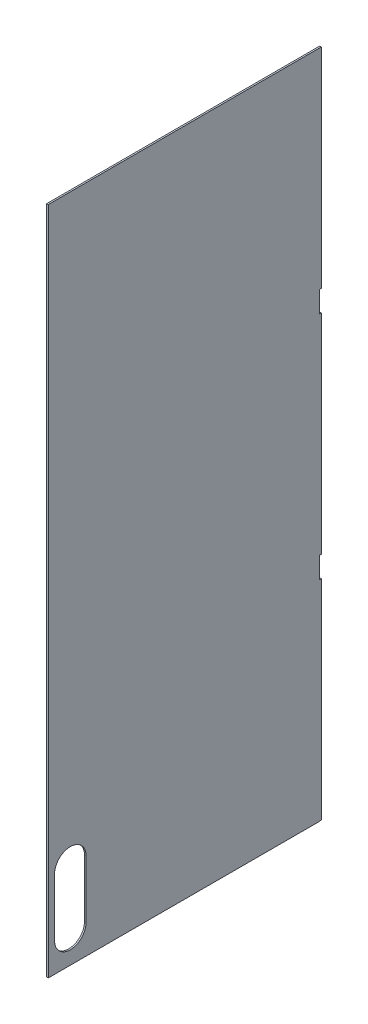
ISO-10303-21;
HEADER;
FILE_DESCRIPTION(('STEP AP214'),'2;1');
FILE_NAME('part.step','',(''),(''),'','','');
FILE_SCHEMA(('AUTOMOTIVE_DESIGN { 1 0 10303 214 1 1 1 1 }'));
ENDSEC;
DATA;
#1=APPLICATION_CONTEXT('core data for automotive mechanical design processes');
#2=APPLICATION_PROTOCOL_DEFINITION('international standard','automotive_design',2000,#1);
#3=PRODUCT_CONTEXT('',#1,'mechanical');
#4=PRODUCT('Part','Part','',(#3));
#5=PRODUCT_RELATED_PRODUCT_CATEGORY('part','',(#4));
#6=PRODUCT_DEFINITION_FORMATION('','',#4);
#7=PRODUCT_DEFINITION_CONTEXT('part definition',#1,'design');
#8=PRODUCT_DEFINITION('design','',#6,#7);
#9=PRODUCT_DEFINITION_SHAPE('','',#8);
#10=(LENGTH_UNIT() NAMED_UNIT(*) SI_UNIT(.MILLI.,.METRE.));
#11=(NAMED_UNIT(*) PLANE_ANGLE_UNIT() SI_UNIT($,.RADIAN.));
#12=(NAMED_UNIT(*) SI_UNIT($,.STERADIAN.) SOLID_ANGLE_UNIT());
#13=UNCERTAINTY_MEASURE_WITH_UNIT(LENGTH_MEASURE(1.E-05),#10,'distance_accuracy_value','');
#14=(GEOMETRIC_REPRESENTATION_CONTEXT(3) GLOBAL_UNCERTAINTY_ASSIGNED_CONTEXT((#13)) GLOBAL_UNIT_ASSIGNED_CONTEXT((#10,
#11,#12)) REPRESENTATION_CONTEXT('',''));
#15=CARTESIAN_POINT('',(0.,0.,0.));
#16=DIRECTION('',(0.,0.,1.));
#17=DIRECTION('',(1.,0.,0.));
#18=AXIS2_PLACEMENT_3D('',#15,#16,#17);
#19=CARTESIAN_POINT('',(-726.5,-317.792893218814,1.));
#20=DIRECTION('',(1.,0.,0.));
#21=DIRECTION('',(0.,0.,-1.));
#22=AXIS2_PLACEMENT_3D('',#19,#20,#21);
#23=PLANE('',#22);
#24=CARTESIAN_POINT('',(-726.500000000001,-235.,237.5));
#25=DIRECTION('',(-1.,0.,0.));
#26=DIRECTION('',(0.,0.,1.));
#27=AXIS2_PLACEMENT_3D('',#24,#25,#26);
#28=CIRCLE('',#27,14.9999999999999);
#29=CARTESIAN_POINT('',(-726.500000000001,-235.,252.5));
#30=VERTEX_POINT('',#29);
#31=CARTESIAN_POINT('',(-726.500000000001,-235.,222.5));
#32=VERTEX_POINT('',#31);
#33=EDGE_CURVE('E298',#30,#32,#28,.T.);
#34=ORIENTED_EDGE('',*,*,#33,.T.);
#35=DIRECTION('',(0.,1.,0.));
#36=VECTOR('',#35,1.);
#37=CARTESIAN_POINT('',(-726.500000000001,0.,222.5));
#38=LINE('',#37,#36);
#39=CARTESIAN_POINT('',(-726.500000000001,-290.,222.5));
#40=VERTEX_POINT('',#39);
#41=EDGE_CURVE('E317',#32,#40,#38,.F.);
#42=ORIENTED_EDGE('',*,*,#41,.T.);
#43=CARTESIAN_POINT('',(-726.500000000001,-290.,237.5));
#44=DIRECTION('',(-1.,0.,0.));
#45=DIRECTION('',(0.,0.,1.));
#46=AXIS2_PLACEMENT_3D('',#43,#44,#45);
#47=CIRCLE('',#46,14.9999999999999);
#48=CARTESIAN_POINT('',(-726.500000000001,-290.,252.5));
#49=VERTEX_POINT('',#48);
#50=EDGE_CURVE('E339',#40,#49,#47,.T.);
#51=ORIENTED_EDGE('',*,*,#50,.T.);
#52=DIRECTION('',(0.,1.,0.));
#53=VECTOR('',#52,1.);
#54=CARTESIAN_POINT('',(-726.500000000001,0.,252.5));
#55=LINE('',#54,#53);
#56=EDGE_CURVE('E333',#49,#30,#55,.T.);
#57=ORIENTED_EDGE('',*,*,#56,.T.);
#58=EDGE_LOOP('',(#34,#42,#51,#57));
#59=FACE_BOUND('',#58,.T.);
#60=DIRECTION('',(0.,1.,0.));
#61=VECTOR('',#60,1.);
#62=CARTESIAN_POINT('',(-726.5,120.884517796865,0.1));
#63=LINE('',#62,#61);
#64=CARTESIAN_POINT('',(-726.5,100.684517796864,0.1));
#65=VERTEX_POINT('',#64);
#66=CARTESIAN_POINT('',(-726.5,120.884517796865,0.1));
#67=VERTEX_POINT('',#66);
#68=EDGE_CURVE('E299',#65,#67,#63,.T.);
#69=ORIENTED_EDGE('',*,*,#68,.T.);
#70=DIRECTION('',(0.,0.,-1.));
#71=VECTOR('',#70,1.);
#72=CARTESIAN_POINT('',(-726.5,120.884517796865,0.1));
#73=LINE('',#72,#71);
#74=CARTESIAN_POINT('',(-726.5,120.884517796865,-1.5));
#75=VERTEX_POINT('',#74);
#76=EDGE_CURVE('E204',#67,#75,#73,.T.);
#77=ORIENTED_EDGE('',*,*,#76,.T.);
#78=DIRECTION('',(0.,-1.,0.));
#79=VECTOR('',#78,1.);
#80=CARTESIAN_POINT('',(-726.5,0.,-1.5));
#81=LINE('',#80,#79);
#82=CARTESIAN_POINT('',(-726.5,320.,-1.5));
#83=VERTEX_POINT('',#82);
#84=EDGE_CURVE('E216',#83,#75,#81,.T.);
#85=ORIENTED_EDGE('',*,*,#84,.F.);
#86=DIRECTION('',(0.,0.,1.));
#87=VECTOR('',#86,1.);
#88=CARTESIAN_POINT('',(-726.500000000001,320.,-1.5));
#89=LINE('',#88,#87);
#90=CARTESIAN_POINT('',(-726.500000000001,320.,258.5));
#91=VERTEX_POINT('',#90);
#92=EDGE_CURVE('E323',#91,#83,#89,.F.);
#93=ORIENTED_EDGE('',*,*,#92,.F.);
#94=DIRECTION('',(0.,1.,0.));
#95=VECTOR('',#94,1.);
#96=CARTESIAN_POINT('',(-726.500000000001,0.,258.5));
#97=LINE('',#96,#95);
#98=CARTESIAN_POINT('',(-726.500000000001,-317.792893218814,258.5));
#99=VERTEX_POINT('',#98);
#100=EDGE_CURVE('E353',#91,#99,#97,.F.);
#101=ORIENTED_EDGE('',*,*,#100,.T.);
#102=DIRECTION('',(0.,0.,-1.));
#103=VECTOR('',#102,1.);
#104=CARTESIAN_POINT('',(-726.5,-317.792893218814,-2.4980018054066E-12));
#105=LINE('',#104,#103);
#106=CARTESIAN_POINT('',(-726.5,-317.792893218814,1.));
#107=VERTEX_POINT('',#106);
#108=EDGE_CURVE('E346',#99,#107,#105,.T.);
#109=ORIENTED_EDGE('',*,*,#108,.T.);
#110=CARTESIAN_POINT('',(-726.5,-317.792893218814,1.));
#111=CARTESIAN_POINT('',(-726.5,-317.784324295965,0.954107267267132));
#112=CARTESIAN_POINT('',(-726.5,-317.775774839545,0.908209186846959));
#113=CARTESIAN_POINT('',(-726.5,-317.758973154533,0.816353117641926));
#114=CARTESIAN_POINT('',(-726.5,-317.750720962585,0.770395122189989));
#115=CARTESIAN_POINT('',(-726.5,-317.734773720594,0.678377723070099));
#116=CARTESIAN_POINT('',(-726.5,-317.727078713487,0.632318311868616));
#117=CARTESIAN_POINT('',(-726.5,-317.712394025256,0.540089541026442));
#118=CARTESIAN_POINT('',(-726.5,-317.705404307616,0.493920187204902));
#119=CARTESIAN_POINT('',(-726.5,-317.685591894286,0.355204281802609));
#120=CARTESIAN_POINT('',(-726.5,-317.67393288804,0.262489101570714));
#121=CARTESIAN_POINT('',(-726.5,-317.653420708062,0.0767443534257716));
#122=CARTESIAN_POINT('',(-726.5,-317.644567892739,-0.0162852531136731));
#123=CARTESIAN_POINT('',(-726.5,-317.629527596252,-0.196216495216096));
#124=CARTESIAN_POINT('',(-726.5,-317.62320028246,-0.283106769124041));
#125=CARTESIAN_POINT('',(-726.5,-317.611932839187,-0.456978337331027));
#126=CARTESIAN_POINT('',(-726.5,-317.606992761954,-0.543959634934596));
#127=CARTESIAN_POINT('',(-726.5,-317.59502296354,-0.778800464799918));
#128=CARTESIAN_POINT('',(-726.5,-317.588946872899,-0.926707611121921));
#129=CARTESIAN_POINT('',(-726.5,-317.578552954195,-1.22258747394609));
#130=CARTESIAN_POINT('',(-726.5,-317.57423523122,-1.3705601938383));
#131=CARTESIAN_POINT('',(-726.5,-317.566714885274,-1.66659415584523));
#132=CARTESIAN_POINT('',(-726.5,-317.563512722981,-1.81465540929793));
#133=CARTESIAN_POINT('',(-726.5,-317.557881025978,-2.11077177124919));
#134=CARTESIAN_POINT('',(-726.5,-317.555451381066,-2.25882687760905));
#135=CARTESIAN_POINT('',(-726.500000000001,-317.553235139561,-2.40688321877565));
#136=B_SPLINE_CURVE_WITH_KNOTS('',3,(#110,#111,#112,#113,#114,#115,#116,#117,#118,#119,#120,
#121,#122,#123,#124,#125,#126,#127,#128,#129,#130,#131,#132,#133,#134,#135),.UNSPECIFIED.,.F.,
.F.,(4,2,2,2,2,2,2,2,2,2,2,2,4),(0.,0.140060374045701,0.280137954604849,0.420226317550014,
0.560307423634171,0.840589053562525,1.12090646680133,1.38225317043666,1.64360971618805,
2.08768514081056,2.53178710138466,2.97607224018538,3.42029397242696),.UNSPECIFIED.);
#137=CARTESIAN_POINT('',(-726.500000000028,-317.570949809761,-1.49999999999999));
#138=VERTEX_POINT('',#137);
#139=EDGE_CURVE('E373',#107,#138,#136,.T.);
#140=ORIENTED_EDGE('',*,*,#139,.T.);
#141=CARTESIAN_POINT('',(-726.5,-118.530964406271,-1.5));
#142=VERTEX_POINT('',#141);
#143=EDGE_CURVE('E211',#142,#138,#81,.T.);
#144=ORIENTED_EDGE('',*,*,#143,.F.);
#145=DIRECTION('',(0.,0.,-1.));
#146=VECTOR('',#145,1.);
#147=CARTESIAN_POINT('',(-726.5,-118.530964406271,0.1));
#148=LINE('',#147,#146);
#149=CARTESIAN_POINT('',(-726.5,-118.530964406271,0.1));
#150=VERTEX_POINT('',#149);
#151=EDGE_CURVE('E58',#150,#142,#148,.T.);
#152=ORIENTED_EDGE('',*,*,#151,.F.);
#153=DIRECTION('',(0.,1.,0.));
#154=VECTOR('',#153,1.);
#155=CARTESIAN_POINT('',(-726.5,-98.330964406271,0.1));
#156=LINE('',#155,#154);
#157=CARTESIAN_POINT('',(-726.5,-98.330964406271,0.1));
#158=VERTEX_POINT('',#157);
#159=EDGE_CURVE('E228',#150,#158,#156,.T.);
#160=ORIENTED_EDGE('',*,*,#159,.T.);
#161=DIRECTION('',(0.,0.,-1.));
#162=VECTOR('',#161,1.);
#163=CARTESIAN_POINT('',(-726.5,-98.330964406271,0.1));
#164=LINE('',#163,#162);
#165=CARTESIAN_POINT('',(-726.5,-98.330964406271,-1.5));
#166=VERTEX_POINT('',#165);
#167=EDGE_CURVE('E231',#158,#166,#164,.T.);
#168=ORIENTED_EDGE('',*,*,#167,.T.);
#169=CARTESIAN_POINT('',(-726.5,100.684517796864,-1.5));
#170=VERTEX_POINT('',#169);
#171=EDGE_CURVE('E214',#170,#166,#81,.T.);
#172=ORIENTED_EDGE('',*,*,#171,.F.);
#173=DIRECTION('',(0.,0.,-1.));
#174=VECTOR('',#173,1.);
#175=CARTESIAN_POINT('',(-726.5,100.684517796864,0.1));
#176=LINE('',#175,#174);
#177=EDGE_CURVE('E66',#65,#170,#176,.T.);
#178=ORIENTED_EDGE('',*,*,#177,.F.);
#179=EDGE_LOOP('',(#69,#77,#85,#93,#101,#109,#140,#144,#152,#160,#168,#172,#178));
#180=FACE_BOUND('',#179,.T.);
#181=ADVANCED_FACE('F42',(#59,#180),#23,.T.);
#182=CARTESIAN_POINT('',(-728.,0.,-2.52575738102223E-12));
#183=DIRECTION('',(1.,0.,0.));
#184=DIRECTION('',(0.,0.,-1.));
#185=AXIS2_PLACEMENT_3D('',#182,#183,#184);
#186=PLANE('',#185);
#187=DIRECTION('',(0.,1.,0.));
#188=VECTOR('',#187,1.);
#189=CARTESIAN_POINT('',(-728.000000000001,0.,252.5));
#190=LINE('',#189,#188);
#191=CARTESIAN_POINT('',(-728.000000000001,-290.,252.5));
#192=VERTEX_POINT('',#191);
#193=CARTESIAN_POINT('',(-728.000000000001,-235.,252.5));
#194=VERTEX_POINT('',#193);
#195=EDGE_CURVE('E352',#192,#194,#190,.T.);
#196=ORIENTED_EDGE('',*,*,#195,.F.);
#197=CARTESIAN_POINT('',(-728.000000000001,-290.,237.5));
#198=DIRECTION('',(-1.,0.,0.));
#199=DIRECTION('',(0.,0.,1.));
#200=AXIS2_PLACEMENT_3D('',#197,#198,#199);
#201=CIRCLE('',#200,14.9999999999999);
#202=CARTESIAN_POINT('',(-728.000000000001,-290.,222.5));
#203=VERTEX_POINT('',#202);
#204=EDGE_CURVE('E358',#203,#192,#201,.T.);
#205=ORIENTED_EDGE('',*,*,#204,.F.);
#206=DIRECTION('',(0.,1.,0.));
#207=VECTOR('',#206,1.);
#208=CARTESIAN_POINT('',(-728.000000000001,0.,222.5));
#209=LINE('',#208,#207);
#210=CARTESIAN_POINT('',(-728.000000000001,-235.,222.5));
#211=VERTEX_POINT('',#210);
#212=EDGE_CURVE('E354',#211,#203,#209,.F.);
#213=ORIENTED_EDGE('',*,*,#212,.F.);
#214=CARTESIAN_POINT('',(-728.000000000001,-235.,237.5));
#215=DIRECTION('',(-1.,0.,0.));
#216=DIRECTION('',(0.,0.,1.));
#217=AXIS2_PLACEMENT_3D('',#214,#215,#216);
#218=CIRCLE('',#217,14.9999999999999);
#219=EDGE_CURVE('E349',#194,#211,#218,.T.);
#220=ORIENTED_EDGE('',*,*,#219,.F.);
#221=EDGE_LOOP('',(#196,#205,#213,#220));
#222=FACE_BOUND('',#221,.T.);
#223=DIRECTION('',(0.,0.,-1.));
#224=VECTOR('',#223,1.);
#225=CARTESIAN_POINT('',(-728.,120.884517796865,0.1));
#226=LINE('',#225,#224);
#227=CARTESIAN_POINT('',(-728.,120.884517796865,0.1));
#228=VERTEX_POINT('',#227);
#229=CARTESIAN_POINT('',(-728.,120.884517796865,-1.5));
#230=VERTEX_POINT('',#229);
#231=EDGE_CURVE('E202',#228,#230,#226,.T.);
#232=ORIENTED_EDGE('',*,*,#231,.F.);
#233=DIRECTION('',(0.,-1.,0.));
#234=VECTOR('',#233,1.);
#235=CARTESIAN_POINT('',(-728.,120.884517796865,0.1));
#236=LINE('',#235,#234);
#237=CARTESIAN_POINT('',(-728.,100.684517796864,0.1));
#238=VERTEX_POINT('',#237);
#239=EDGE_CURVE('E189',#228,#238,#236,.T.);
#240=ORIENTED_EDGE('',*,*,#239,.T.);
#241=DIRECTION('',(0.,0.,-1.));
#242=VECTOR('',#241,1.);
#243=CARTESIAN_POINT('',(-728.,100.684517796864,0.1));
#244=LINE('',#243,#242);
#245=CARTESIAN_POINT('',(-728.,100.684517796864,-1.5));
#246=VERTEX_POINT('',#245);
#247=EDGE_CURVE('E212',#238,#246,#244,.T.);
#248=ORIENTED_EDGE('',*,*,#247,.T.);
#249=DIRECTION('',(0.,1.,0.));
#250=VECTOR('',#249,1.);
#251=CARTESIAN_POINT('',(-728.,0.,-1.5));
#252=LINE('',#251,#250);
#253=CARTESIAN_POINT('',(-728.,-98.330964406271,-1.5));
#254=VERTEX_POINT('',#253);
#255=EDGE_CURVE('E310',#254,#246,#252,.T.);
#256=ORIENTED_EDGE('',*,*,#255,.F.);
#257=DIRECTION('',(0.,0.,-1.));
#258=VECTOR('',#257,1.);
#259=CARTESIAN_POINT('',(-728.,-98.330964406271,0.1));
#260=LINE('',#259,#258);
#261=CARTESIAN_POINT('',(-728.,-98.330964406271,0.1));
#262=VERTEX_POINT('',#261);
#263=EDGE_CURVE('E205',#262,#254,#260,.T.);
#264=ORIENTED_EDGE('',*,*,#263,.F.);
#265=DIRECTION('',(0.,-1.,0.));
#266=VECTOR('',#265,1.);
#267=CARTESIAN_POINT('',(-728.,-98.330964406271,0.1));
#268=LINE('',#267,#266);
#269=CARTESIAN_POINT('',(-728.,-118.530964406271,0.1));
#270=VERTEX_POINT('',#269);
#271=EDGE_CURVE('E223',#262,#270,#268,.T.);
#272=ORIENTED_EDGE('',*,*,#271,.T.);
#273=DIRECTION('',(0.,0.,-1.));
#274=VECTOR('',#273,1.);
#275=CARTESIAN_POINT('',(-728.,-118.530964406271,0.1));
#276=LINE('',#275,#274);
#277=CARTESIAN_POINT('',(-728.,-118.530964406271,-1.5));
#278=VERTEX_POINT('',#277);
#279=EDGE_CURVE('E235',#270,#278,#276,.T.);
#280=ORIENTED_EDGE('',*,*,#279,.T.);
#281=CARTESIAN_POINT('',(-728.,-317.646446609407,-1.5));
#282=VERTEX_POINT('',#281);
#283=EDGE_CURVE('E249',#282,#278,#252,.T.);
#284=ORIENTED_EDGE('',*,*,#283,.F.);
#285=CARTESIAN_POINT('',(-728.,-317.792893218814,1.));
#286=CARTESIAN_POINT('',(-728.,-317.785944806708,0.906875573864813));
#287=CARTESIAN_POINT('',(-728.,-317.779001364591,0.81375066601592));
#288=CARTESIAN_POINT('',(-728.,-317.765281159909,0.62748748307537));
#289=CARTESIAN_POINT('',(-728.,-317.758504399368,0.534349207835172));
#290=CARTESIAN_POINT('',(-728.,-317.738660880626,0.254918404201124));
#291=CARTESIAN_POINT('',(-727.999999999998,-317.726079381561,0.0685906193646139));
#292=CARTESIAN_POINT('',(-727.999999999998,-317.70018630794,-0.347993530088112));
#293=CARTESIAN_POINT('',(-728.,-317.687397996636,-0.578283009925215));
#294=CARTESIAN_POINT('',(-728.,-317.670470206659,-0.923839383547908));
#295=CARTESIAN_POINT('',(-727.999999999999,-317.665203124079,-1.03905259168799));
#296=CARTESIAN_POINT('',(-728.000000000001,-317.655340926058,-1.26950688956619));
#297=CARTESIAN_POINT('',(-728.000000000004,-317.65074580507,-1.38474797906626));
#298=CARTESIAN_POINT('',(-728.000000000011,-317.646446609407,-1.49999999999999));
#299=B_SPLINE_CURVE_WITH_KNOTS('',3,(#285,#286,#287,#288,#289,#290,#291,#292,#293,#294,#295,
#296,#297,#298),.UNSPECIFIED.,.F.,.F.,(4,2,2,2,2,2,4),(0.,0.280150009180552,0.560303419019111,
1.12055222826663,1.81246142168486,2.15846039154656,2.50445650482587),.UNSPECIFIED.);
#300=CARTESIAN_POINT('',(-728.,-317.792893218814,1.));
#301=VERTEX_POINT('',#300);
#302=EDGE_CURVE('E239',#301,#282,#299,.T.);
#303=ORIENTED_EDGE('',*,*,#302,.F.);
#304=DIRECTION('',(0.,0.,-1.));
#305=VECTOR('',#304,1.);
#306=CARTESIAN_POINT('',(-728.,-317.792893218814,-2.52575738102223E-12));
#307=LINE('',#306,#305);
#308=CARTESIAN_POINT('',(-728.000000000001,-317.792893218814,258.5));
#309=VERTEX_POINT('',#308);
#310=EDGE_CURVE('E357',#309,#301,#307,.T.);
#311=ORIENTED_EDGE('',*,*,#310,.F.);
#312=DIRECTION('',(0.,1.,0.));
#313=VECTOR('',#312,1.);
#314=CARTESIAN_POINT('',(-728.000000000001,0.,258.5));
#315=LINE('',#314,#313);
#316=CARTESIAN_POINT('',(-728.000000000001,320.,258.5));
#317=VERTEX_POINT('',#316);
#318=EDGE_CURVE('E361',#317,#309,#315,.F.);
#319=ORIENTED_EDGE('',*,*,#318,.F.);
#320=DIRECTION('',(0.,0.,1.));
#321=VECTOR('',#320,1.);
#322=CARTESIAN_POINT('',(-728.,320.,-1.5));
#323=LINE('',#322,#321);
#324=CARTESIAN_POINT('',(-728.,320.,-1.5));
#325=VERTEX_POINT('',#324);
#326=EDGE_CURVE('E318',#325,#317,#323,.T.);
#327=ORIENTED_EDGE('',*,*,#326,.F.);
#328=EDGE_CURVE('E210',#230,#325,#252,.T.);
#329=ORIENTED_EDGE('',*,*,#328,.F.);
#330=EDGE_LOOP('',(#232,#240,#248,#256,#264,#272,#280,#284,#303,#311,#319,#327,#329));
#331=FACE_BOUND('',#330,.T.);
#332=ADVANCED_FACE('F208',(#222,#331),#186,.F.);
#333=CARTESIAN_POINT('',(0.,0.,-1.5));
#334=DIRECTION('',(0.,0.,-1.));
#335=DIRECTION('',(-1.,0.,0.));
#336=AXIS2_PLACEMENT_3D('',#333,#334,#335);
#337=PLANE('',#336);
#338=ORIENTED_EDGE('',*,*,#84,.T.);
#339=DIRECTION('',(-1.,0.,0.));
#340=VECTOR('',#339,1.);
#341=CARTESIAN_POINT('',(0.,120.884517796865,-1.5));
#342=LINE('',#341,#340);
#343=EDGE_CURVE('E11',#75,#230,#342,.T.);
#344=ORIENTED_EDGE('',*,*,#343,.T.);
#345=ORIENTED_EDGE('',*,*,#328,.T.);
#346=DIRECTION('',(-1.,0.,0.));
#347=VECTOR('',#346,1.);
#348=CARTESIAN_POINT('',(0.,320.,-1.5));
#349=LINE('',#348,#347);
#350=EDGE_CURVE('E326',#325,#83,#349,.F.);
#351=ORIENTED_EDGE('',*,*,#350,.T.);
#352=EDGE_LOOP('',(#338,#344,#345,#351));
#353=FACE_BOUND('',#352,.T.);
#354=ADVANCED_FACE('F44',(#353),#337,.T.);
#355=ORIENTED_EDGE('',*,*,#255,.T.);
#356=DIRECTION('',(1.,0.,0.));
#357=VECTOR('',#356,1.);
#358=CARTESIAN_POINT('',(0.,100.684517796864,-1.5));
#359=LINE('',#358,#357);
#360=EDGE_CURVE('E51',#246,#170,#359,.T.);
#361=ORIENTED_EDGE('',*,*,#360,.T.);
#362=ORIENTED_EDGE('',*,*,#171,.T.);
#363=DIRECTION('',(-1.,0.,0.));
#364=VECTOR('',#363,1.);
#365=CARTESIAN_POINT('',(0.,-98.330964406271,-1.5));
#366=LINE('',#365,#364);
#367=EDGE_CURVE('E315',#166,#254,#366,.T.);
#368=ORIENTED_EDGE('',*,*,#367,.T.);
#369=EDGE_LOOP('',(#355,#361,#362,#368));
#370=FACE_BOUND('',#369,.T.);
#371=ADVANCED_FACE('F313',(#370),#337,.T.);
#372=ORIENTED_EDGE('',*,*,#283,.T.);
#373=DIRECTION('',(1.,0.,0.));
#374=VECTOR('',#373,1.);
#375=CARTESIAN_POINT('',(0.,-118.530964406271,-1.5));
#376=LINE('',#375,#374);
#377=EDGE_CURVE('E379',#278,#142,#376,.T.);
#378=ORIENTED_EDGE('',*,*,#377,.T.);
#379=ORIENTED_EDGE('',*,*,#143,.T.);
#380=CARTESIAN_POINT('',(-725.5,-317.5,-1.5));
#381=CARTESIAN_POINT('',(-725.593120946873,-317.506950071026,-1.5));
#382=CARTESIAN_POINT('',(-725.686242733995,-317.513892321386,-1.5));
#383=CARTESIAN_POINT('',(-725.872499598058,-317.52761015388,-1.5));
#384=CARTESIAN_POINT('',(-725.965634675136,-317.534385734126,-1.5));
#385=CARTESIAN_POINT('',(-726.151925007462,-317.547618849673,-1.5));
#386=CARTESIAN_POINT('',(-726.24508026207,-317.554076393891,-1.5));
#387=CARTESIAN_POINT('',(-726.431418588072,-317.566570716482,-1.5));
#388=CARTESIAN_POINT('',(-726.524601659342,-317.572607496693,-1.5));
#389=CARTESIAN_POINT('',(-726.80420826892,-317.58998294894,-1.5));
#390=CARTESIAN_POINT('',(-726.990678264813,-317.600585937226,-1.5));
#391=CARTESIAN_POINT('',(-727.363724268063,-317.619779662148,-1.5));
#392=CARTESIAN_POINT('',(-727.550300277245,-317.62837036304,-1.5));
#393=CARTESIAN_POINT('',(-727.923530705726,-317.643831643858,-1.5));
#394=CARTESIAN_POINT('',(-728.110185128106,-317.650702148313,-1.5));
#395=CARTESIAN_POINT('',(-728.483541319224,-317.663070364639,-1.5));
#396=CARTESIAN_POINT('',(-728.670243088605,-317.668568056818,-1.5));
#397=CARTESIAN_POINT('',(-729.043671219912,-317.678505575859,-1.5));
#398=CARTESIAN_POINT('',(-729.23039758141,-317.682945419222,-1.5));
#399=CARTESIAN_POINT('',(-729.603861968932,-317.691001185622,-1.5));
#400=CARTESIAN_POINT('',(-729.790599994353,-317.694617136349,-1.5));
#401=CARTESIAN_POINT('',(-729.977342208897,-317.697938195438,-1.5));
#402=B_SPLINE_CURVE_WITH_KNOTS('',3,(#380,#381,#382,#383,#384,#385,#386,#387,#388,#389,#390,
#391,#392,#393,#394,#395,#396,#397,#398,#399,#400,#401),.UNSPECIFIED.,.F.,.F.,(4,2,2,2,2,2,2,2,
2,2,4),(0.,0.280140261511787,0.560283694469571,0.840419268631949,1.12055361889483,
1.68085521905735,2.24116677092624,2.80150290136089,3.36184706896815,3.92218249499454,
4.48249908574021),.UNSPECIFIED.);
#403=EDGE_CURVE('E248',#138,#282,#402,.T.);
#404=ORIENTED_EDGE('',*,*,#403,.T.);
#405=EDGE_LOOP('',(#372,#378,#379,#404));
#406=FACE_BOUND('',#405,.T.);
#407=ADVANCED_FACE('F267',(#406),#337,.T.);
#408=CARTESIAN_POINT('',(-718.000000000001,-235.,222.5));
#409=DIRECTION('',(0.,0.,-1.));
#410=DIRECTION('',(-1.,0.,0.));
#411=AXIS2_PLACEMENT_3D('',#408,#409,#410);
#412=PLANE('',#411);
#413=ORIENTED_EDGE('',*,*,#212,.T.);
#414=DIRECTION('',(-1.,0.,0.));
#415=VECTOR('',#414,1.);
#416=CARTESIAN_POINT('',(-718.000000000001,-290.,222.5));
#417=LINE('',#416,#415);
#418=EDGE_CURVE('E336',#40,#203,#417,.T.);
#419=ORIENTED_EDGE('',*,*,#418,.F.);
#420=ORIENTED_EDGE('',*,*,#41,.F.);
#421=DIRECTION('',(-1.,0.,0.));
#422=VECTOR('',#421,1.);
#423=CARTESIAN_POINT('',(-718.000000000001,-235.,222.5));
#424=LINE('',#423,#422);
#425=EDGE_CURVE('E334',#211,#32,#424,.F.);
#426=ORIENTED_EDGE('',*,*,#425,.F.);
#427=EDGE_LOOP('',(#413,#419,#420,#426));
#428=FACE_BOUND('',#427,.T.);
#429=ADVANCED_FACE('F263',(#428),#412,.F.);
#430=CARTESIAN_POINT('',(-718.000000000001,-290.,237.5));
#431=DIRECTION('',(-1.,0.,0.));
#432=DIRECTION('',(0.,0.,1.));
#433=AXIS2_PLACEMENT_3D('',#430,#431,#432);
#434=CYLINDRICAL_SURFACE('',#433,14.9999999999999);
#435=ORIENTED_EDGE('',*,*,#204,.T.);
#436=DIRECTION('',(1.,0.,0.));
#437=VECTOR('',#436,1.);
#438=CARTESIAN_POINT('',(-718.000000000001,-290.,252.5));
#439=LINE('',#438,#437);
#440=EDGE_CURVE('E342',#192,#49,#439,.T.);
#441=ORIENTED_EDGE('',*,*,#440,.T.);
#442=ORIENTED_EDGE('',*,*,#50,.F.);
#443=ORIENTED_EDGE('',*,*,#418,.T.);
#444=EDGE_LOOP('',(#435,#441,#442,#443));
#445=FACE_BOUND('',#444,.T.);
#446=ADVANCED_FACE('F266',(#445),#434,.F.);
#447=CARTESIAN_POINT('',(-718.000000000001,-235.,237.5));
#448=DIRECTION('',(-1.,0.,0.));
#449=DIRECTION('',(0.,0.,1.));
#450=AXIS2_PLACEMENT_3D('',#447,#448,#449);
#451=CYLINDRICAL_SURFACE('',#450,14.9999999999999);
#452=ORIENTED_EDGE('',*,*,#219,.T.);
#453=ORIENTED_EDGE('',*,*,#425,.T.);
#454=ORIENTED_EDGE('',*,*,#33,.F.);
#455=DIRECTION('',(-1.,0.,0.));
#456=VECTOR('',#455,1.);
#457=CARTESIAN_POINT('',(-718.000000000001,-235.,252.5));
#458=LINE('',#457,#456);
#459=EDGE_CURVE('E340',#194,#30,#458,.F.);
#460=ORIENTED_EDGE('',*,*,#459,.F.);
#461=EDGE_LOOP('',(#452,#453,#454,#460));
#462=FACE_BOUND('',#461,.T.);
#463=ADVANCED_FACE('F269',(#462),#451,.F.);
#464=CARTESIAN_POINT('',(-726.5,-317.792893218814,0.));
#465=DIRECTION('',(0.,1.,0.));
#466=DIRECTION('',(0.,0.,1.));
#467=AXIS2_PLACEMENT_3D('',#464,#465,#466);
#468=PLANE('',#467);
#469=DIRECTION('',(1.,0.,0.));
#470=VECTOR('',#469,1.);
#471=CARTESIAN_POINT('',(-727.249925,-317.792893218814,1.));
#472=LINE('',#471,#470);
#473=EDGE_CURVE('E337',#301,#107,#472,.T.);
#474=ORIENTED_EDGE('',*,*,#473,.T.);
#475=ORIENTED_EDGE('',*,*,#108,.F.);
#476=DIRECTION('',(1.,0.,0.));
#477=VECTOR('',#476,1.);
#478=CARTESIAN_POINT('',(-726.5,-317.792893218814,258.5));
#479=LINE('',#478,#477);
#480=EDGE_CURVE('E348',#309,#99,#479,.T.);
#481=ORIENTED_EDGE('',*,*,#480,.F.);
#482=ORIENTED_EDGE('',*,*,#310,.T.);
#483=EDGE_LOOP('',(#474,#475,#481,#482));
#484=FACE_BOUND('',#483,.T.);
#485=ADVANCED_FACE('F272',(#484),#468,.F.);
#486=CARTESIAN_POINT('',(-728.000000000001,320.,258.5));
#487=DIRECTION('',(0.,0.,-1.));
#488=DIRECTION('',(-1.,0.,0.));
#489=AXIS2_PLACEMENT_3D('',#486,#487,#488);
#490=PLANE('',#489);
#491=ORIENTED_EDGE('',*,*,#100,.F.);
#492=DIRECTION('',(-1.,0.,0.));
#493=VECTOR('',#492,1.);
#494=CARTESIAN_POINT('',(-728.000000000001,320.,258.5));
#495=LINE('',#494,#493);
#496=EDGE_CURVE('E330',#317,#91,#495,.F.);
#497=ORIENTED_EDGE('',*,*,#496,.F.);
#498=ORIENTED_EDGE('',*,*,#318,.T.);
#499=ORIENTED_EDGE('',*,*,#480,.T.);
#500=EDGE_LOOP('',(#491,#497,#498,#499));
#501=FACE_BOUND('',#500,.T.);
#502=ADVANCED_FACE('F285',(#501),#490,.F.);
#503=CARTESIAN_POINT('',(-729.050747109369,-317.792893218814,1.));
#504=CARTESIAN_POINT('',(-729.050747109369,-317.768480987753,0.535124489158987));
#505=CARTESIAN_POINT('',(-728.958330666275,-317.744077682345,0.0705994562272967));
#506=CARTESIAN_POINT('',(-728.602594492657,-317.695262145876,-0.788223638775395));
#507=CARTESIAN_POINT('',(-728.339414729102,-317.670854377641,-1.18209998952427));
#508=CARTESIAN_POINT('',(-727.682099989521,-317.622038841172,-1.83941472910352));
#509=CARTESIAN_POINT('',(-727.288223638775,-317.597631072938,-2.10259449265518));
#510=CARTESIAN_POINT('',(-726.429400543773,-317.548815536469,-2.45833066628434));
#511=CARTESIAN_POINT('',(-725.964875510841,-317.524412231068,-2.55074710936904));
#512=CARTESIAN_POINT('',(-725.5,-317.5,-2.55074710936904));
#513=CARTESIAN_POINT('',(-728.015,-317.792893218814,1.));
#514=CARTESIAN_POINT('',(-728.015,-317.768481073035,0.670728235423468));
#515=CARTESIAN_POINT('',(-727.949541281821,-317.744077682345,0.341704070836391));
#516=CARTESIAN_POINT('',(-727.697572766711,-317.695262145876,-0.26660173563281));
#517=CARTESIAN_POINT('',(-727.511162108631,-317.670854377641,-0.545585000736898));
#518=CARTESIAN_POINT('',(-727.045585000737,-317.622038841172,-1.01116210863139));
#519=CARTESIAN_POINT('',(-726.766601735633,-317.597631072938,-1.19757276671092));
#520=CARTESIAN_POINT('',(-726.158295929164,-317.548815536469,-1.44954128182079));
#521=CARTESIAN_POINT('',(-725.829271764576,-317.524412145779,-1.51499999999999));
#522=CARTESIAN_POINT('',(-725.5,-317.5,-1.51499999999999));
#523=CARTESIAN_POINT('',(-728.,-317.792893218814,1.));
#524=CARTESIAN_POINT('',(-728.,-317.76848107427,0.672692089510596));
#525=CARTESIAN_POINT('',(-727.934931691671,-317.744077682345,0.345630289101784));
#526=CARTESIAN_POINT('',(-727.684465970886,-317.695262145876,-0.259047450927252));
#527=CARTESIAN_POINT('',(-727.499167105996,-317.670854377641,-0.536366799937266));
#528=CARTESIAN_POINT('',(-727.036366799937,-317.622038841172,-0.99916710599543));
#529=CARTESIAN_POINT('',(-726.759047450927,-317.597631072938,-1.18446597088562));
#530=CARTESIAN_POINT('',(-726.154369710898,-317.548815536469,-1.43493169167078));
#531=CARTESIAN_POINT('',(-725.827307910489,-317.524412144544,-1.5));
#532=CARTESIAN_POINT('',(-725.5,-317.5,-1.5));
#533=CARTESIAN_POINT('',(-726.5,-317.792893218814,1.));
#534=CARTESIAN_POINT('',(-726.5,-317.768481197786,0.869077498224763));
#535=CARTESIAN_POINT('',(-726.473972676668,-317.744077682345,0.738252115640714));
#536=CARTESIAN_POINT('',(-726.373786388354,-317.695262145876,0.496381019629094));
#537=CARTESIAN_POINT('',(-726.299666842398,-317.670854377641,0.385453280025094));
#538=CARTESIAN_POINT('',(-726.114546719975,-317.622038841172,0.200333157601817));
#539=CARTESIAN_POINT('',(-726.003618980371,-317.597631072938,0.126213611645748));
#540=CARTESIAN_POINT('',(-725.761747884359,-317.548815536469,0.0260273233316788));
#541=CARTESIAN_POINT('',(-725.630922501775,-317.524412021028,0.));
#542=CARTESIAN_POINT('',(-725.5,-317.5,0.));
#543=CARTESIAN_POINT('',(-726.48485,-317.792893218814,1.));
#544=CARTESIAN_POINT('',(-726.48485,-317.768481199033,0.871060990852768));
#545=CARTESIAN_POINT('',(-726.459216990617,-317.744077682345,0.742217596088751));
#546=CARTESIAN_POINT('',(-726.360548524571,-317.695262145876,0.504010847181713));
#547=CARTESIAN_POINT('',(-726.287551889736,-317.670854377641,0.394763662832698));
#548=CARTESIAN_POINT('',(-726.105236337167,-317.622038841172,0.212448110264163));
#549=CARTESIAN_POINT('',(-725.995989152819,-317.597631072938,0.13945147542932));
#550=CARTESIAN_POINT('',(-725.757782403911,-317.548815536469,0.0407830093832051));
#551=CARTESIAN_POINT('',(-725.628939009147,-317.52441201978,0.0151499999999916));
#552=CARTESIAN_POINT('',(-725.5,-317.5,0.0151499999999916));
#553=CARTESIAN_POINT('',(-725.792893218813,-317.792893218814,1.));
#554=CARTESIAN_POINT('',(-725.792893218813,-317.768481256011,0.961654467709858));
#555=CARTESIAN_POINT('',(-725.785269992317,-317.744077682345,0.923335819632564));
#556=CARTESIAN_POINT('',(-725.755926107837,-317.695262145876,0.852493415784458));
#557=CARTESIAN_POINT('',(-725.734216995449,-317.670854377641,0.820003433075594));
#558=CARTESIAN_POINT('',(-725.679996566925,-317.622038841172,0.765783004553582));
#559=CARTESIAN_POINT('',(-725.647506584225,-317.597631072938,0.744073892161264));
#560=CARTESIAN_POINT('',(-725.576664180369,-317.548815536469,0.71473000769599));
#561=CARTESIAN_POINT('',(-725.538345532289,-317.524411962802,0.707106781187868));
#562=CARTESIAN_POINT('',(-725.5,-317.5,0.707106781187868));
#563=B_SPLINE_SURFACE_WITH_KNOTS('',1,3,((#503,#504,#505,#506,#507,#508,#509,#510,#511,#512),
(#513,#514,#515,#516,#517,#518,#519,#520,#521,#522),(#523,#524,#525,#526,#527,#528,#529,#530,
#531,#532),(#533,#534,#535,#536,#537,#538,#539,#540,#541,#542),(#543,#544,#545,#546,#547,#548,
#549,#550,#551,#552),(#553,#554,#555,#556,#557,#558,#559,#560,#561,#562)),.UNSPECIFIED.,.F.,.F.,
.F.,(2,1,1,1,1,2),(4,2,2,2,4),(-0.700498072913285,-0.01,0.,1.,1.0101,1.47140452079217),(0.,0.25,
0.5,0.75,1.),.UNSPECIFIED.);
#564=ORIENTED_EDGE('',*,*,#403,.F.);
#565=ORIENTED_EDGE('',*,*,#139,.F.);
#566=ORIENTED_EDGE('',*,*,#473,.F.);
#567=ORIENTED_EDGE('',*,*,#302,.T.);
#568=EDGE_LOOP('',(#564,#565,#566,#567));
#569=FACE_BOUND('',#568,.T.);
#570=ADVANCED_FACE('F251',(#569),#563,.F.);
#571=CARTESIAN_POINT('',(-730.,320.,-1.5));
#572=DIRECTION('',(0.,1.,0.));
#573=DIRECTION('',(0.,0.,1.));
#574=AXIS2_PLACEMENT_3D('',#571,#572,#573);
#575=PLANE('',#574);
#576=ORIENTED_EDGE('',*,*,#92,.T.);
#577=ORIENTED_EDGE('',*,*,#350,.F.);
#578=ORIENTED_EDGE('',*,*,#326,.T.);
#579=ORIENTED_EDGE('',*,*,#496,.T.);
#580=EDGE_LOOP('',(#576,#577,#578,#579));
#581=FACE_BOUND('',#580,.T.);
#582=ADVANCED_FACE('F278',(#581),#575,.T.);
#583=CARTESIAN_POINT('',(-718.000000000001,-235.,252.5));
#584=DIRECTION('',(0.,0.,1.));
#585=DIRECTION('',(1.,0.,0.));
#586=AXIS2_PLACEMENT_3D('',#583,#584,#585);
#587=PLANE('',#586);
#588=ORIENTED_EDGE('',*,*,#195,.T.);
#589=ORIENTED_EDGE('',*,*,#459,.T.);
#590=ORIENTED_EDGE('',*,*,#56,.F.);
#591=ORIENTED_EDGE('',*,*,#440,.F.);
#592=EDGE_LOOP('',(#588,#589,#590,#591));
#593=FACE_BOUND('',#592,.T.);
#594=ADVANCED_FACE('F274',(#593),#587,.F.);
#595=CARTESIAN_POINT('',(-726.5,-98.330964406271,0.1));
#596=DIRECTION('',(0.,-1.,0.));
#597=DIRECTION('',(0.,0.,-1.));
#598=AXIS2_PLACEMENT_3D('',#595,#596,#597);
#599=PLANE('',#598);
#600=ORIENTED_EDGE('',*,*,#167,.F.);
#601=DIRECTION('',(-1.,0.,0.));
#602=VECTOR('',#601,1.);
#603=CARTESIAN_POINT('',(-726.5,-98.330964406271,0.1));
#604=LINE('',#603,#602);
#605=EDGE_CURVE('E220',#158,#262,#604,.T.);
#606=ORIENTED_EDGE('',*,*,#605,.T.);
#607=ORIENTED_EDGE('',*,*,#263,.T.);
#608=ORIENTED_EDGE('',*,*,#367,.F.);
#609=EDGE_LOOP('',(#600,#606,#607,#608));
#610=FACE_BOUND('',#609,.T.);
#611=ADVANCED_FACE('F277',(#610),#599,.T.);
#612=CARTESIAN_POINT('',(-726.5,-118.530964406271,0.1));
#613=DIRECTION('',(0.,1.,0.));
#614=DIRECTION('',(0.,0.,1.));
#615=AXIS2_PLACEMENT_3D('',#612,#613,#614);
#616=PLANE('',#615);
#617=ORIENTED_EDGE('',*,*,#279,.F.);
#618=DIRECTION('',(1.,0.,0.));
#619=VECTOR('',#618,1.);
#620=CARTESIAN_POINT('',(-726.5,-118.530964406271,0.1));
#621=LINE('',#620,#619);
#622=EDGE_CURVE('E226',#270,#150,#621,.T.);
#623=ORIENTED_EDGE('',*,*,#622,.T.);
#624=ORIENTED_EDGE('',*,*,#151,.T.);
#625=ORIENTED_EDGE('',*,*,#377,.F.);
#626=EDGE_LOOP('',(#617,#623,#624,#625));
#627=FACE_BOUND('',#626,.T.);
#628=ADVANCED_FACE('F395',(#627),#616,.T.);
#629=CARTESIAN_POINT('',(0.,0.,0.1));
#630=DIRECTION('',(0.,0.,1.));
#631=DIRECTION('',(1.,0.,0.));
#632=AXIS2_PLACEMENT_3D('',#629,#630,#631);
#633=PLANE('',#632);
#634=ORIENTED_EDGE('',*,*,#605,.F.);
#635=ORIENTED_EDGE('',*,*,#159,.F.);
#636=ORIENTED_EDGE('',*,*,#622,.F.);
#637=ORIENTED_EDGE('',*,*,#271,.F.);
#638=EDGE_LOOP('',(#634,#635,#636,#637));
#639=FACE_BOUND('',#638,.T.);
#640=ADVANCED_FACE('F399',(#639),#633,.F.);
#641=CARTESIAN_POINT('',(-726.5,120.884517796865,0.1));
#642=DIRECTION('',(0.,-1.,0.));
#643=DIRECTION('',(0.,0.,-1.));
#644=AXIS2_PLACEMENT_3D('',#641,#642,#643);
#645=PLANE('',#644);
#646=ORIENTED_EDGE('',*,*,#76,.F.);
#647=DIRECTION('',(-1.,0.,0.));
#648=VECTOR('',#647,1.);
#649=CARTESIAN_POINT('',(-726.5,120.884517796865,0.1));
#650=LINE('',#649,#648);
#651=EDGE_CURVE('E193',#67,#228,#650,.T.);
#652=ORIENTED_EDGE('',*,*,#651,.T.);
#653=ORIENTED_EDGE('',*,*,#231,.T.);
#654=ORIENTED_EDGE('',*,*,#343,.F.);
#655=EDGE_LOOP('',(#646,#652,#653,#654));
#656=FACE_BOUND('',#655,.T.);
#657=ADVANCED_FACE('F201',(#656),#645,.T.);
#658=CARTESIAN_POINT('',(-726.5,100.684517796864,0.1));
#659=DIRECTION('',(0.,1.,0.));
#660=DIRECTION('',(0.,0.,1.));
#661=AXIS2_PLACEMENT_3D('',#658,#659,#660);
#662=PLANE('',#661);
#663=ORIENTED_EDGE('',*,*,#247,.F.);
#664=DIRECTION('',(1.,0.,0.));
#665=VECTOR('',#664,1.);
#666=CARTESIAN_POINT('',(-726.5,100.684517796864,0.1));
#667=LINE('',#666,#665);
#668=EDGE_CURVE('E195',#238,#65,#667,.T.);
#669=ORIENTED_EDGE('',*,*,#668,.T.);
#670=ORIENTED_EDGE('',*,*,#177,.T.);
#671=ORIENTED_EDGE('',*,*,#360,.F.);
#672=EDGE_LOOP('',(#663,#669,#670,#671));
#673=FACE_BOUND('',#672,.T.);
#674=ADVANCED_FACE('F306',(#673),#662,.T.);
#675=CARTESIAN_POINT('',(0.,0.,0.1));
#676=DIRECTION('',(0.,0.,1.));
#677=DIRECTION('',(1.,0.,0.));
#678=AXIS2_PLACEMENT_3D('',#675,#676,#677);
#679=PLANE('',#678);
#680=ORIENTED_EDGE('',*,*,#651,.F.);
#681=ORIENTED_EDGE('',*,*,#68,.F.);
#682=ORIENTED_EDGE('',*,*,#668,.F.);
#683=ORIENTED_EDGE('',*,*,#239,.F.);
#684=EDGE_LOOP('',(#680,#681,#682,#683));
#685=FACE_BOUND('',#684,.T.);
#686=ADVANCED_FACE('F191',(#685),#679,.F.);
#687=CLOSED_SHELL('',(#181,#332,#354,#371,#407,#429,#446,#463,#485,#502,#570,#582,#594,#611,
#628,#640,#657,#674,#686));
#688=MANIFOLD_SOLID_BREP('B2',#687);
#689=ADVANCED_BREP_SHAPE_REPRESENTATION('',(#18,#688),#14);
#690=SHAPE_DEFINITION_REPRESENTATION(#9,#689);
ENDSEC;
END-ISO-10303-21;
